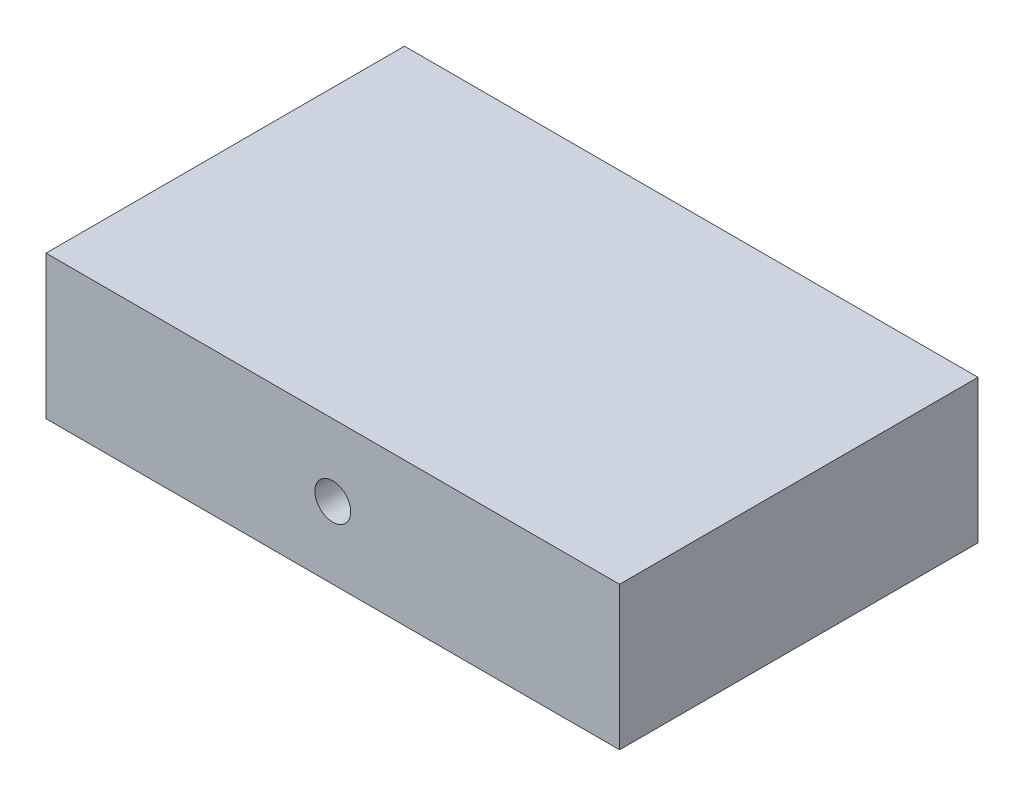
ISO-10303-21;
HEADER;
FILE_DESCRIPTION(('STEP AP214'),'2;1');
FILE_NAME('part.step','',(''),(''),'','','');
FILE_SCHEMA(('AUTOMOTIVE_DESIGN { 1 0 10303 214 1 1 1 1 }'));
ENDSEC;
DATA;
#1=APPLICATION_CONTEXT('core data for automotive mechanical design processes');
#2=APPLICATION_PROTOCOL_DEFINITION('international standard','automotive_design',2000,#1);
#3=PRODUCT_CONTEXT('',#1,'mechanical');
#4=PRODUCT('Part','Part','',(#3));
#5=PRODUCT_RELATED_PRODUCT_CATEGORY('part','',(#4));
#6=PRODUCT_DEFINITION_FORMATION('','',#4);
#7=PRODUCT_DEFINITION_CONTEXT('part definition',#1,'design');
#8=PRODUCT_DEFINITION('design','',#6,#7);
#9=PRODUCT_DEFINITION_SHAPE('','',#8);
#10=(LENGTH_UNIT() NAMED_UNIT(*) SI_UNIT(.MILLI.,.METRE.));
#11=(NAMED_UNIT(*) PLANE_ANGLE_UNIT() SI_UNIT($,.RADIAN.));
#12=(NAMED_UNIT(*) SI_UNIT($,.STERADIAN.) SOLID_ANGLE_UNIT());
#13=UNCERTAINTY_MEASURE_WITH_UNIT(LENGTH_MEASURE(1.E-05),#10,'distance_accuracy_value','');
#14=(GEOMETRIC_REPRESENTATION_CONTEXT(3) GLOBAL_UNCERTAINTY_ASSIGNED_CONTEXT((#13)) GLOBAL_UNIT_ASSIGNED_CONTEXT((#10,
#11,#12)) REPRESENTATION_CONTEXT('',''));
#15=CARTESIAN_POINT('',(0.,0.,0.));
#16=DIRECTION('',(0.,0.,1.));
#17=DIRECTION('',(1.,0.,0.));
#18=AXIS2_PLACEMENT_3D('',#15,#16,#17);
#19=CARTESIAN_POINT('',(0.,0.,34.9999999999682));
#20=DIRECTION('',(0.,0.,1.));
#21=DIRECTION('',(1.,0.,0.));
#22=AXIS2_PLACEMENT_3D('',#19,#20,#21);
#23=CONICAL_SURFACE('',#22,2.49999999994089,1.02974425867857);
#24=CARTESIAN_POINT('',(5.6843418860808E-11,0.,33.4978484524129));
#25=VERTEX_POINT('',#24);
#26=VERTEX_LOOP('',#25);
#27=FACE_BOUND('',#26,.T.);
#28=CARTESIAN_POINT('',(0.,0.,35.));
#29=DIRECTION('',(0.,0.,1.));
#30=DIRECTION('',(1.,0.,0.));
#31=AXIS2_PLACEMENT_3D('',#28,#29,#30);
#32=CIRCLE('',#31,2.5);
#33=CARTESIAN_POINT('',(2.5,0.,35.));
#34=VERTEX_POINT('',#33);
#35=EDGE_CURVE('E65',#34,#34,#32,.T.);
#36=ORIENTED_EDGE('',*,*,#35,.T.);
#37=EDGE_LOOP('',(#36));
#38=FACE_BOUND('',#37,.T.);
#39=ADVANCED_FACE('F17',(#27,#38),#23,.F.);
#40=CARTESIAN_POINT('',(0.,0.,50.));
#41=DIRECTION('',(0.,0.,1.));
#42=DIRECTION('',(1.,0.,0.));
#43=AXIS2_PLACEMENT_3D('',#40,#41,#42);
#44=CYLINDRICAL_SURFACE('',#43,2.5);
#45=ORIENTED_EDGE('',*,*,#35,.F.);
#46=EDGE_LOOP('',(#45));
#47=FACE_BOUND('',#46,.T.);
#48=CARTESIAN_POINT('',(0.,0.,50.));
#49=DIRECTION('',(0.,0.,1.));
#50=DIRECTION('',(1.,0.,0.));
#51=AXIS2_PLACEMENT_3D('',#48,#49,#50);
#52=CIRCLE('',#51,2.5);
#53=CARTESIAN_POINT('',(2.5,0.,50.));
#54=VERTEX_POINT('',#53);
#55=EDGE_CURVE('E20',#54,#54,#52,.T.);
#56=ORIENTED_EDGE('',*,*,#55,.T.);
#57=EDGE_LOOP('',(#56));
#58=FACE_BOUND('',#57,.T.);
#59=ADVANCED_FACE('F62',(#47,#58),#44,.F.);
#60=CARTESIAN_POINT('',(-40.,-10.,50.));
#61=DIRECTION('',(0.,1.,0.));
#62=DIRECTION('',(0.,0.,1.));
#63=AXIS2_PLACEMENT_3D('',#60,#61,#62);
#64=PLANE('',#63);
#65=DIRECTION('',(0.,0.,1.));
#66=VECTOR('',#65,1.);
#67=CARTESIAN_POINT('',(40.,-10.,50.));
#68=LINE('',#67,#66);
#69=CARTESIAN_POINT('',(40.,-10.,0.));
#70=VERTEX_POINT('',#69);
#71=CARTESIAN_POINT('',(40.,-10.,50.));
#72=VERTEX_POINT('',#71);
#73=EDGE_CURVE('E67',#70,#72,#68,.T.);
#74=ORIENTED_EDGE('',*,*,#73,.T.);
#75=DIRECTION('',(-1.,0.,0.));
#76=VECTOR('',#75,1.);
#77=CARTESIAN_POINT('',(0.,-10.,50.));
#78=LINE('',#77,#76);
#79=CARTESIAN_POINT('',(-40.,-10.,50.));
#80=VERTEX_POINT('',#79);
#81=EDGE_CURVE('E56',#72,#80,#78,.T.);
#82=ORIENTED_EDGE('',*,*,#81,.T.);
#83=DIRECTION('',(0.,0.,-1.));
#84=VECTOR('',#83,1.);
#85=CARTESIAN_POINT('',(-40.,-10.,50.));
#86=LINE('',#85,#84);
#87=CARTESIAN_POINT('',(-40.,-10.,0.));
#88=VERTEX_POINT('',#87);
#89=EDGE_CURVE('E76',#80,#88,#86,.T.);
#90=ORIENTED_EDGE('',*,*,#89,.T.);
#91=DIRECTION('',(-1.,0.,0.));
#92=VECTOR('',#91,1.);
#93=CARTESIAN_POINT('',(0.,-10.,0.));
#94=LINE('',#93,#92);
#95=EDGE_CURVE('E82',#70,#88,#94,.T.);
#96=ORIENTED_EDGE('',*,*,#95,.F.);
#97=EDGE_LOOP('',(#74,#82,#90,#96));
#98=FACE_BOUND('',#97,.T.);
#99=ADVANCED_FACE('F121',(#98),#64,.F.);
#100=CARTESIAN_POINT('',(40.,-10.,50.));
#101=DIRECTION('',(-1.,0.,0.));
#102=DIRECTION('',(0.,0.,1.));
#103=AXIS2_PLACEMENT_3D('',#100,#101,#102);
#104=PLANE('',#103);
#105=DIRECTION('',(0.,0.,-1.));
#106=VECTOR('',#105,1.);
#107=CARTESIAN_POINT('',(40.,10.,50.));
#108=LINE('',#107,#106);
#109=CARTESIAN_POINT('',(40.,10.,0.));
#110=VERTEX_POINT('',#109);
#111=CARTESIAN_POINT('',(40.,10.,50.));
#112=VERTEX_POINT('',#111);
#113=EDGE_CURVE('E85',#110,#112,#108,.F.);
#114=ORIENTED_EDGE('',*,*,#113,.T.);
#115=DIRECTION('',(0.,1.,0.));
#116=VECTOR('',#115,1.);
#117=CARTESIAN_POINT('',(40.,0.,50.));
#118=LINE('',#117,#116);
#119=EDGE_CURVE('E71',#112,#72,#118,.F.);
#120=ORIENTED_EDGE('',*,*,#119,.T.);
#121=ORIENTED_EDGE('',*,*,#73,.F.);
#122=DIRECTION('',(0.,1.,0.));
#123=VECTOR('',#122,1.);
#124=CARTESIAN_POINT('',(40.,0.,0.));
#125=LINE('',#124,#123);
#126=EDGE_CURVE('E79',#110,#70,#125,.F.);
#127=ORIENTED_EDGE('',*,*,#126,.F.);
#128=EDGE_LOOP('',(#114,#120,#121,#127));
#129=FACE_BOUND('',#128,.T.);
#130=ADVANCED_FACE('F102',(#129),#104,.F.);
#131=CARTESIAN_POINT('',(0.,0.,50.));
#132=DIRECTION('',(0.,0.,-1.));
#133=DIRECTION('',(-1.,0.,0.));
#134=AXIS2_PLACEMENT_3D('',#131,#132,#133);
#135=PLANE('',#134);
#136=DIRECTION('',(1.,0.,0.));
#137=VECTOR('',#136,1.);
#138=CARTESIAN_POINT('',(-40.,10.,50.));
#139=LINE('',#138,#137);
#140=CARTESIAN_POINT('',(-40.,10.,50.));
#141=VERTEX_POINT('',#140);
#142=EDGE_CURVE('E88',#112,#141,#139,.F.);
#143=ORIENTED_EDGE('',*,*,#142,.T.);
#144=DIRECTION('',(0.,1.,0.));
#145=VECTOR('',#144,1.);
#146=CARTESIAN_POINT('',(-40.,-10.,50.));
#147=LINE('',#146,#145);
#148=EDGE_CURVE('E74',#141,#80,#147,.F.);
#149=ORIENTED_EDGE('',*,*,#148,.T.);
#150=ORIENTED_EDGE('',*,*,#81,.F.);
#151=ORIENTED_EDGE('',*,*,#119,.F.);
#152=EDGE_LOOP('',(#143,#149,#150,#151));
#153=FACE_BOUND('',#152,.T.);
#154=ORIENTED_EDGE('',*,*,#55,.F.);
#155=EDGE_LOOP('',(#154));
#156=FACE_BOUND('',#155,.T.);
#157=ADVANCED_FACE('F99',(#153,#156),#135,.F.);
#158=CARTESIAN_POINT('',(-40.,-10.,50.));
#159=DIRECTION('',(1.,0.,0.));
#160=DIRECTION('',(0.,0.,-1.));
#161=AXIS2_PLACEMENT_3D('',#158,#159,#160);
#162=PLANE('',#161);
#163=ORIENTED_EDGE('',*,*,#89,.F.);
#164=ORIENTED_EDGE('',*,*,#148,.F.);
#165=DIRECTION('',(0.,0.,-1.));
#166=VECTOR('',#165,1.);
#167=CARTESIAN_POINT('',(-40.,10.,50.));
#168=LINE('',#167,#166);
#169=CARTESIAN_POINT('',(-40.,10.,0.));
#170=VERTEX_POINT('',#169);
#171=EDGE_CURVE('E26',#141,#170,#168,.T.);
#172=ORIENTED_EDGE('',*,*,#171,.T.);
#173=DIRECTION('',(0.,1.,0.));
#174=VECTOR('',#173,1.);
#175=CARTESIAN_POINT('',(-40.,0.,0.));
#176=LINE('',#175,#174);
#177=EDGE_CURVE('E34',#88,#170,#176,.T.);
#178=ORIENTED_EDGE('',*,*,#177,.F.);
#179=EDGE_LOOP('',(#163,#164,#172,#178));
#180=FACE_BOUND('',#179,.T.);
#181=ADVANCED_FACE('F95',(#180),#162,.F.);
#182=CARTESIAN_POINT('',(0.,0.,0.));
#183=DIRECTION('',(0.,0.,-1.));
#184=DIRECTION('',(-1.,0.,0.));
#185=AXIS2_PLACEMENT_3D('',#182,#183,#184);
#186=PLANE('',#185);
#187=ORIENTED_EDGE('',*,*,#177,.T.);
#188=DIRECTION('',(1.,0.,0.));
#189=VECTOR('',#188,1.);
#190=CARTESIAN_POINT('',(-40.,10.,0.));
#191=LINE('',#190,#189);
#192=EDGE_CURVE('E11',#170,#110,#191,.T.);
#193=ORIENTED_EDGE('',*,*,#192,.T.);
#194=ORIENTED_EDGE('',*,*,#126,.T.);
#195=ORIENTED_EDGE('',*,*,#95,.T.);
#196=EDGE_LOOP('',(#187,#193,#194,#195));
#197=FACE_BOUND('',#196,.T.);
#198=ADVANCED_FACE('F105',(#197),#186,.T.);
#199=CARTESIAN_POINT('',(-40.,10.,50.));
#200=DIRECTION('',(0.,-1.,0.));
#201=DIRECTION('',(0.,0.,-1.));
#202=AXIS2_PLACEMENT_3D('',#199,#200,#201);
#203=PLANE('',#202);
#204=ORIENTED_EDGE('',*,*,#171,.F.);
#205=ORIENTED_EDGE('',*,*,#142,.F.);
#206=ORIENTED_EDGE('',*,*,#113,.F.);
#207=ORIENTED_EDGE('',*,*,#192,.F.);
#208=EDGE_LOOP('',(#204,#205,#206,#207));
#209=FACE_BOUND('',#208,.T.);
#210=ADVANCED_FACE('F98',(#209),#203,.F.);
#211=CLOSED_SHELL('',(#39,#59,#99,#130,#157,#181,#198,#210));
#212=MANIFOLD_SOLID_BREP('B1',#211);
#213=ADVANCED_BREP_SHAPE_REPRESENTATION('',(#18,#212),#14);
#214=SHAPE_DEFINITION_REPRESENTATION(#9,#213);
ENDSEC;
END-ISO-10303-21;
